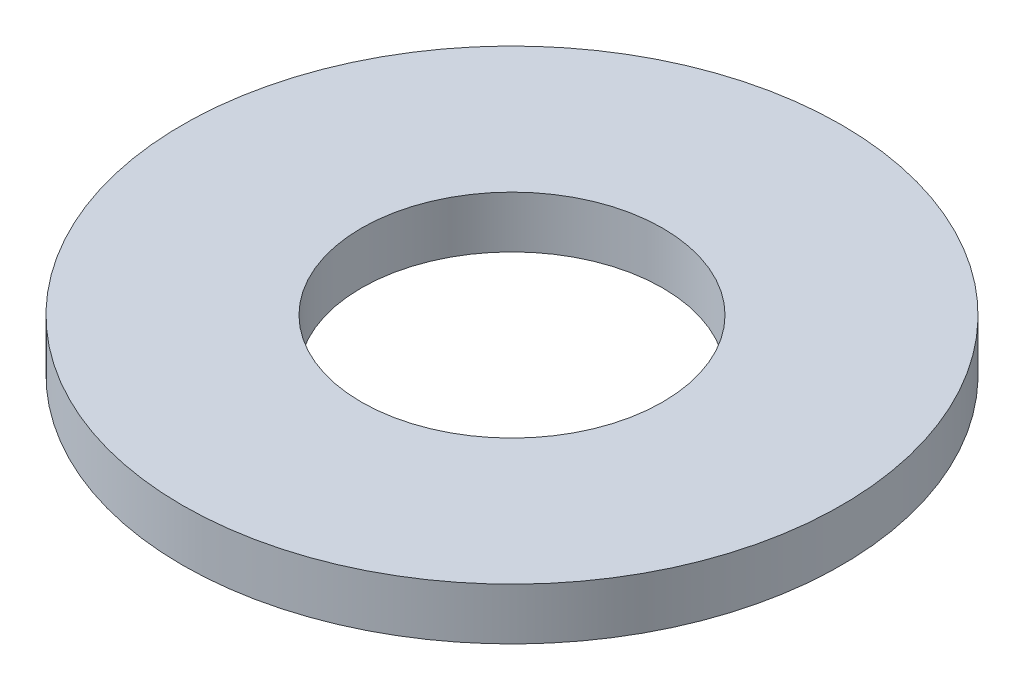
ISO-10303-21;
HEADER;
FILE_DESCRIPTION(('STEP AP214'),'2;1');
FILE_NAME('part.step','',(''),(''),'','','');
FILE_SCHEMA(('AUTOMOTIVE_DESIGN { 1 0 10303 214 1 1 1 1 }'));
ENDSEC;
DATA;
#1=APPLICATION_CONTEXT('core data for automotive mechanical design processes');
#2=APPLICATION_PROTOCOL_DEFINITION('international standard','automotive_design',2000,#1);
#3=PRODUCT_CONTEXT('',#1,'mechanical');
#4=PRODUCT('Part','Part','',(#3));
#5=PRODUCT_RELATED_PRODUCT_CATEGORY('part','',(#4));
#6=PRODUCT_DEFINITION_FORMATION('','',#4);
#7=PRODUCT_DEFINITION_CONTEXT('part definition',#1,'design');
#8=PRODUCT_DEFINITION('design','',#6,#7);
#9=PRODUCT_DEFINITION_SHAPE('','',#8);
#10=(LENGTH_UNIT() NAMED_UNIT(*) SI_UNIT(.MILLI.,.METRE.));
#11=(NAMED_UNIT(*) PLANE_ANGLE_UNIT() SI_UNIT($,.RADIAN.));
#12=(NAMED_UNIT(*) SI_UNIT($,.STERADIAN.) SOLID_ANGLE_UNIT());
#13=UNCERTAINTY_MEASURE_WITH_UNIT(LENGTH_MEASURE(1.E-05),#10,'distance_accuracy_value','');
#14=(GEOMETRIC_REPRESENTATION_CONTEXT(3) GLOBAL_UNCERTAINTY_ASSIGNED_CONTEXT((#13)) GLOBAL_UNIT_ASSIGNED_CONTEXT((#10,
#11,#12)) REPRESENTATION_CONTEXT('',''));
#15=CARTESIAN_POINT('',(0.,0.,0.));
#16=DIRECTION('',(0.,0.,1.));
#17=DIRECTION('',(1.,0.,0.));
#18=AXIS2_PLACEMENT_3D('',#15,#16,#17);
#19=CARTESIAN_POINT('',(0.,0.55,0.));
#20=DIRECTION('',(0.,1.,0.));
#21=DIRECTION('',(0.,0.,1.));
#22=AXIS2_PLACEMENT_3D('',#19,#20,#21);
#23=PLANE('',#22);
#24=CARTESIAN_POINT('',(0.,0.55,0.));
#25=DIRECTION('',(0.,1.,0.));
#26=DIRECTION('',(0.,0.,1.));
#27=AXIS2_PLACEMENT_3D('',#24,#25,#26);
#28=CIRCLE('',#27,3.5);
#29=CARTESIAN_POINT('',(0.,0.55,3.5));
#30=VERTEX_POINT('',#29);
#31=EDGE_CURVE('E10',#30,#30,#28,.T.);
#32=ORIENTED_EDGE('',*,*,#31,.T.);
#33=EDGE_LOOP('',(#32));
#34=FACE_BOUND('',#33,.T.);
#35=CARTESIAN_POINT('',(0.,0.55,0.));
#36=DIRECTION('',(0.,1.,0.));
#37=DIRECTION('',(0.,0.,1.));
#38=AXIS2_PLACEMENT_3D('',#35,#36,#37);
#39=CIRCLE('',#38,1.6);
#40=CARTESIAN_POINT('',(0.,0.55,1.6));
#41=VERTEX_POINT('',#40);
#42=EDGE_CURVE('E41',#41,#41,#39,.T.);
#43=ORIENTED_EDGE('',*,*,#42,.F.);
#44=EDGE_LOOP('',(#43));
#45=FACE_BOUND('',#44,.T.);
#46=ADVANCED_FACE('F30',(#34,#45),#23,.T.);
#47=CARTESIAN_POINT('',(0.,0.,0.));
#48=DIRECTION('',(0.,1.,0.));
#49=DIRECTION('',(0.,0.,1.));
#50=AXIS2_PLACEMENT_3D('',#47,#48,#49);
#51=PLANE('',#50);
#52=CARTESIAN_POINT('',(0.,0.,0.));
#53=DIRECTION('',(0.,1.,0.));
#54=DIRECTION('',(0.,0.,1.));
#55=AXIS2_PLACEMENT_3D('',#52,#53,#54);
#56=CIRCLE('',#55,3.5);
#57=CARTESIAN_POINT('',(0.,0.,3.5));
#58=VERTEX_POINT('',#57);
#59=EDGE_CURVE('E34',#58,#58,#56,.T.);
#60=ORIENTED_EDGE('',*,*,#59,.F.);
#61=EDGE_LOOP('',(#60));
#62=FACE_BOUND('',#61,.T.);
#63=CARTESIAN_POINT('',(0.,0.,0.));
#64=DIRECTION('',(0.,1.,0.));
#65=DIRECTION('',(0.,0.,1.));
#66=AXIS2_PLACEMENT_3D('',#63,#64,#65);
#67=CIRCLE('',#66,1.6);
#68=CARTESIAN_POINT('',(0.,0.,1.6));
#69=VERTEX_POINT('',#68);
#70=EDGE_CURVE('E43',#69,#69,#67,.T.);
#71=ORIENTED_EDGE('',*,*,#70,.T.);
#72=EDGE_LOOP('',(#71));
#73=FACE_BOUND('',#72,.T.);
#74=ADVANCED_FACE('F53',(#62,#73),#51,.F.);
#75=CARTESIAN_POINT('',(0.,0.55,0.));
#76=DIRECTION('',(0.,-1.,0.));
#77=DIRECTION('',(0.,0.,-1.));
#78=AXIS2_PLACEMENT_3D('',#75,#76,#77);
#79=CYLINDRICAL_SURFACE('',#78,3.5);
#80=ORIENTED_EDGE('',*,*,#31,.F.);
#81=EDGE_LOOP('',(#80));
#82=FACE_BOUND('',#81,.T.);
#83=ORIENTED_EDGE('',*,*,#59,.T.);
#84=EDGE_LOOP('',(#83));
#85=FACE_BOUND('',#84,.T.);
#86=ADVANCED_FACE('F32',(#82,#85),#79,.T.);
#87=CARTESIAN_POINT('',(0.,0.55,0.));
#88=DIRECTION('',(0.,-1.,0.));
#89=DIRECTION('',(0.,0.,-1.));
#90=AXIS2_PLACEMENT_3D('',#87,#88,#89);
#91=CYLINDRICAL_SURFACE('',#90,1.6);
#92=ORIENTED_EDGE('',*,*,#42,.T.);
#93=EDGE_LOOP('',(#92));
#94=FACE_BOUND('',#93,.T.);
#95=ORIENTED_EDGE('',*,*,#70,.F.);
#96=EDGE_LOOP('',(#95));
#97=FACE_BOUND('',#96,.T.);
#98=ADVANCED_FACE('F49',(#94,#97),#91,.F.);
#99=CLOSED_SHELL('',(#46,#74,#86,#98));
#100=MANIFOLD_SOLID_BREP('B2',#99);
#101=ADVANCED_BREP_SHAPE_REPRESENTATION('',(#18,#100),#14);
#102=SHAPE_DEFINITION_REPRESENTATION(#9,#101);
ENDSEC;
END-ISO-10303-21;
